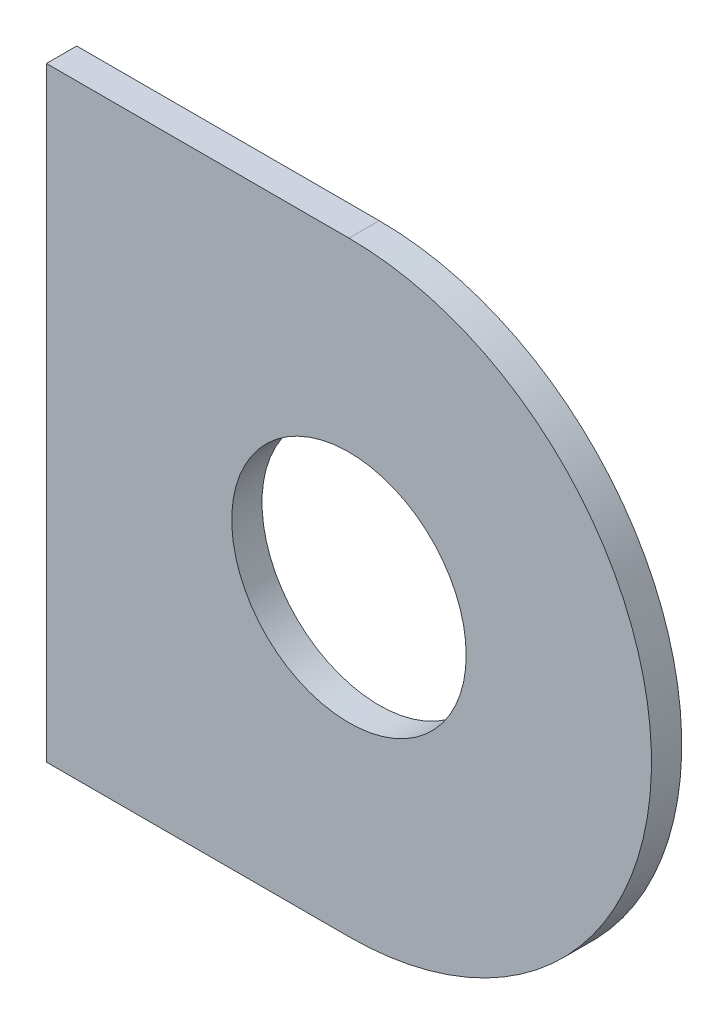
ISO-10303-21;
HEADER;
FILE_DESCRIPTION(('STEP AP214'),'2;1');
FILE_NAME('part.step','',(''),(''),'','','');
FILE_SCHEMA(('AUTOMOTIVE_DESIGN { 1 0 10303 214 1 1 1 1 }'));
ENDSEC;
DATA;
#1=APPLICATION_CONTEXT('core data for automotive mechanical design processes');
#2=APPLICATION_PROTOCOL_DEFINITION('international standard','automotive_design',2000,#1);
#3=PRODUCT_CONTEXT('',#1,'mechanical');
#4=PRODUCT('Part','Part','',(#3));
#5=PRODUCT_RELATED_PRODUCT_CATEGORY('part','',(#4));
#6=PRODUCT_DEFINITION_FORMATION('','',#4);
#7=PRODUCT_DEFINITION_CONTEXT('part definition',#1,'design');
#8=PRODUCT_DEFINITION('design','',#6,#7);
#9=PRODUCT_DEFINITION_SHAPE('','',#8);
#10=(LENGTH_UNIT() NAMED_UNIT(*) SI_UNIT(.MILLI.,.METRE.));
#11=(NAMED_UNIT(*) PLANE_ANGLE_UNIT() SI_UNIT($,.RADIAN.));
#12=(NAMED_UNIT(*) SI_UNIT($,.STERADIAN.) SOLID_ANGLE_UNIT());
#13=UNCERTAINTY_MEASURE_WITH_UNIT(LENGTH_MEASURE(1.E-05),#10,'distance_accuracy_value','');
#14=(GEOMETRIC_REPRESENTATION_CONTEXT(3) GLOBAL_UNCERTAINTY_ASSIGNED_CONTEXT((#13)) GLOBAL_UNIT_ASSIGNED_CONTEXT((#10,
#11,#12)) REPRESENTATION_CONTEXT('',''));
#15=CARTESIAN_POINT('',(0.,0.,0.));
#16=DIRECTION('',(0.,0.,1.));
#17=DIRECTION('',(1.,0.,0.));
#18=AXIS2_PLACEMENT_3D('',#15,#16,#17);
#19=CARTESIAN_POINT('',(20.,20.,2.));
#20=DIRECTION('',(0.,0.,1.));
#21=DIRECTION('',(1.,0.,0.));
#22=AXIS2_PLACEMENT_3D('',#19,#20,#21);
#23=PLANE('',#22);
#24=DIRECTION('',(0.,-1.,0.));
#25=VECTOR('',#24,1.);
#26=CARTESIAN_POINT('',(0.,0.,2.));
#27=LINE('',#26,#25);
#28=CARTESIAN_POINT('',(0.,40.,2.));
#29=VERTEX_POINT('',#28);
#30=CARTESIAN_POINT('',(0.,0.,2.));
#31=VERTEX_POINT('',#30);
#32=EDGE_CURVE('E85',#29,#31,#27,.T.);
#33=ORIENTED_EDGE('',*,*,#32,.T.);
#34=DIRECTION('',(1.,0.,0.));
#35=VECTOR('',#34,1.);
#36=CARTESIAN_POINT('',(0.,0.,2.));
#37=LINE('',#36,#35);
#38=CARTESIAN_POINT('',(20.,0.,2.));
#39=VERTEX_POINT('',#38);
#40=EDGE_CURVE('E80',#31,#39,#37,.T.);
#41=ORIENTED_EDGE('',*,*,#40,.T.);
#42=CARTESIAN_POINT('',(20.,20.,2.));
#43=DIRECTION('',(0.,0.,1.));
#44=DIRECTION('',(1.,0.,0.));
#45=AXIS2_PLACEMENT_3D('',#42,#43,#44);
#46=CIRCLE('',#45,20.);
#47=CARTESIAN_POINT('',(20.,40.,2.));
#48=VERTEX_POINT('',#47);
#49=EDGE_CURVE('E83',#39,#48,#46,.T.);
#50=ORIENTED_EDGE('',*,*,#49,.T.);
#51=DIRECTION('',(-1.,0.,0.));
#52=VECTOR('',#51,1.);
#53=CARTESIAN_POINT('',(0.,40.,2.));
#54=LINE('',#53,#52);
#55=EDGE_CURVE('E50',#48,#29,#54,.T.);
#56=ORIENTED_EDGE('',*,*,#55,.T.);
#57=EDGE_LOOP('',(#33,#41,#50,#56));
#58=FACE_BOUND('',#57,.T.);
#59=CARTESIAN_POINT('',(20.,20.,2.));
#60=DIRECTION('',(0.,0.,1.));
#61=DIRECTION('',(1.,0.,0.));
#62=AXIS2_PLACEMENT_3D('',#59,#60,#61);
#63=CIRCLE('',#62,7.74999999999999);
#64=CARTESIAN_POINT('',(27.75,20.,2.));
#65=VERTEX_POINT('',#64);
#66=EDGE_CURVE('E100',#65,#65,#63,.T.);
#67=ORIENTED_EDGE('',*,*,#66,.F.);
#68=EDGE_LOOP('',(#67));
#69=FACE_BOUND('',#68,.T.);
#70=ADVANCED_FACE('F33',(#58,#69),#23,.T.);
#71=CARTESIAN_POINT('',(20.,20.,0.));
#72=DIRECTION('',(0.,0.,1.));
#73=DIRECTION('',(1.,0.,0.));
#74=AXIS2_PLACEMENT_3D('',#71,#72,#73);
#75=PLANE('',#74);
#76=DIRECTION('',(0.,-1.,0.));
#77=VECTOR('',#76,1.);
#78=CARTESIAN_POINT('',(0.,0.,0.));
#79=LINE('',#78,#77);
#80=CARTESIAN_POINT('',(0.,40.,0.));
#81=VERTEX_POINT('',#80);
#82=CARTESIAN_POINT('',(0.,0.,0.));
#83=VERTEX_POINT('',#82);
#84=EDGE_CURVE('E97',#81,#83,#79,.T.);
#85=ORIENTED_EDGE('',*,*,#84,.F.);
#86=DIRECTION('',(-1.,0.,0.));
#87=VECTOR('',#86,1.);
#88=CARTESIAN_POINT('',(0.,40.,0.));
#89=LINE('',#88,#87);
#90=CARTESIAN_POINT('',(20.,40.,0.));
#91=VERTEX_POINT('',#90);
#92=EDGE_CURVE('E73',#91,#81,#89,.T.);
#93=ORIENTED_EDGE('',*,*,#92,.F.);
#94=CARTESIAN_POINT('',(20.,20.,0.));
#95=DIRECTION('',(0.,0.,1.));
#96=DIRECTION('',(1.,0.,0.));
#97=AXIS2_PLACEMENT_3D('',#94,#95,#96);
#98=CIRCLE('',#97,20.);
#99=CARTESIAN_POINT('',(20.,0.,0.));
#100=VERTEX_POINT('',#99);
#101=EDGE_CURVE('E67',#100,#91,#98,.T.);
#102=ORIENTED_EDGE('',*,*,#101,.F.);
#103=DIRECTION('',(1.,0.,0.));
#104=VECTOR('',#103,1.);
#105=CARTESIAN_POINT('',(0.,0.,0.));
#106=LINE('',#105,#104);
#107=EDGE_CURVE('E89',#83,#100,#106,.T.);
#108=ORIENTED_EDGE('',*,*,#107,.F.);
#109=EDGE_LOOP('',(#85,#93,#102,#108));
#110=FACE_BOUND('',#109,.T.);
#111=CARTESIAN_POINT('',(20.,20.,0.));
#112=DIRECTION('',(0.,0.,1.));
#113=DIRECTION('',(1.,0.,0.));
#114=AXIS2_PLACEMENT_3D('',#111,#112,#113);
#115=CIRCLE('',#114,7.74999999999999);
#116=CARTESIAN_POINT('',(27.75,20.,0.));
#117=VERTEX_POINT('',#116);
#118=EDGE_CURVE('E112',#117,#117,#115,.T.);
#119=ORIENTED_EDGE('',*,*,#118,.T.);
#120=EDGE_LOOP('',(#119));
#121=FACE_BOUND('',#120,.T.);
#122=ADVANCED_FACE('F108',(#110,#121),#75,.F.);
#123=CARTESIAN_POINT('',(0.,0.,2.));
#124=DIRECTION('',(1.,0.,0.));
#125=DIRECTION('',(0.,0.,-1.));
#126=AXIS2_PLACEMENT_3D('',#123,#124,#125);
#127=PLANE('',#126);
#128=ORIENTED_EDGE('',*,*,#84,.T.);
#129=DIRECTION('',(0.,0.,-1.));
#130=VECTOR('',#129,1.);
#131=CARTESIAN_POINT('',(0.,0.,2.));
#132=LINE('',#131,#130);
#133=EDGE_CURVE('E11',#31,#83,#132,.T.);
#134=ORIENTED_EDGE('',*,*,#133,.F.);
#135=ORIENTED_EDGE('',*,*,#32,.F.);
#136=DIRECTION('',(0.,0.,-1.));
#137=VECTOR('',#136,1.);
#138=CARTESIAN_POINT('',(0.,40.,2.));
#139=LINE('',#138,#137);
#140=EDGE_CURVE('E93',#29,#81,#139,.T.);
#141=ORIENTED_EDGE('',*,*,#140,.T.);
#142=EDGE_LOOP('',(#128,#134,#135,#141));
#143=FACE_BOUND('',#142,.T.);
#144=ADVANCED_FACE('F35',(#143),#127,.F.);
#145=CARTESIAN_POINT('',(0.,0.,2.));
#146=DIRECTION('',(0.,1.,0.));
#147=DIRECTION('',(0.,0.,1.));
#148=AXIS2_PLACEMENT_3D('',#145,#146,#147);
#149=PLANE('',#148);
#150=ORIENTED_EDGE('',*,*,#107,.T.);
#151=DIRECTION('',(0.,0.,-1.));
#152=VECTOR('',#151,1.);
#153=CARTESIAN_POINT('',(20.,0.,2.));
#154=LINE('',#153,#152);
#155=EDGE_CURVE('E42',#39,#100,#154,.T.);
#156=ORIENTED_EDGE('',*,*,#155,.F.);
#157=ORIENTED_EDGE('',*,*,#40,.F.);
#158=ORIENTED_EDGE('',*,*,#133,.T.);
#159=EDGE_LOOP('',(#150,#156,#157,#158));
#160=FACE_BOUND('',#159,.T.);
#161=ADVANCED_FACE('F88',(#160),#149,.F.);
#162=CARTESIAN_POINT('',(20.,20.,2.));
#163=DIRECTION('',(0.,0.,-1.));
#164=DIRECTION('',(-1.,0.,0.));
#165=AXIS2_PLACEMENT_3D('',#162,#163,#164);
#166=CYLINDRICAL_SURFACE('',#165,20.);
#167=ORIENTED_EDGE('',*,*,#101,.T.);
#168=DIRECTION('',(0.,0.,-1.));
#169=VECTOR('',#168,1.);
#170=CARTESIAN_POINT('',(20.,40.,2.));
#171=LINE('',#170,#169);
#172=EDGE_CURVE('E90',#48,#91,#171,.T.);
#173=ORIENTED_EDGE('',*,*,#172,.F.);
#174=ORIENTED_EDGE('',*,*,#49,.F.);
#175=ORIENTED_EDGE('',*,*,#155,.T.);
#176=EDGE_LOOP('',(#167,#173,#174,#175));
#177=FACE_BOUND('',#176,.T.);
#178=ADVANCED_FACE('F91',(#177),#166,.T.);
#179=CARTESIAN_POINT('',(0.,40.,2.));
#180=DIRECTION('',(0.,-1.,0.));
#181=DIRECTION('',(1.,0.,0.));
#182=AXIS2_PLACEMENT_3D('',#179,#180,#181);
#183=PLANE('',#182);
#184=ORIENTED_EDGE('',*,*,#92,.T.);
#185=ORIENTED_EDGE('',*,*,#140,.F.);
#186=ORIENTED_EDGE('',*,*,#55,.F.);
#187=ORIENTED_EDGE('',*,*,#172,.T.);
#188=EDGE_LOOP('',(#184,#185,#186,#187));
#189=FACE_BOUND('',#188,.T.);
#190=ADVANCED_FACE('F105',(#189),#183,.F.);
#191=CARTESIAN_POINT('',(20.,20.,2.));
#192=DIRECTION('',(0.,0.,-1.));
#193=DIRECTION('',(-1.,0.,0.));
#194=AXIS2_PLACEMENT_3D('',#191,#192,#193);
#195=CYLINDRICAL_SURFACE('',#194,7.74999999999999);
#196=ORIENTED_EDGE('',*,*,#66,.T.);
#197=EDGE_LOOP('',(#196));
#198=FACE_BOUND('',#197,.T.);
#199=ORIENTED_EDGE('',*,*,#118,.F.);
#200=EDGE_LOOP('',(#199));
#201=FACE_BOUND('',#200,.T.);
#202=ADVANCED_FACE('F118',(#198,#201),#195,.F.);
#203=CLOSED_SHELL('',(#70,#122,#144,#161,#178,#190,#202));
#204=MANIFOLD_SOLID_BREP('B2',#203);
#205=ADVANCED_BREP_SHAPE_REPRESENTATION('',(#18,#204),#14);
#206=SHAPE_DEFINITION_REPRESENTATION(#9,#205);
ENDSEC;
END-ISO-10303-21;
